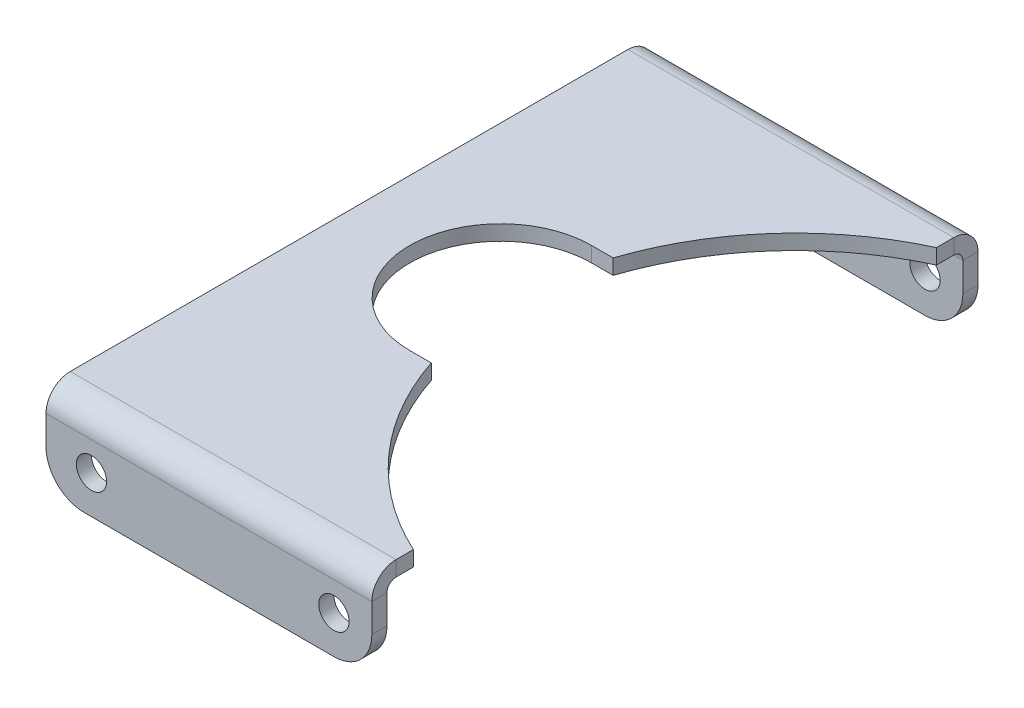
ISO-10303-21;
HEADER;
FILE_DESCRIPTION(('STEP AP214'),'2;1');
FILE_NAME('part.step','',(''),(''),'','','');
FILE_SCHEMA(('AUTOMOTIVE_DESIGN { 1 0 10303 214 1 1 1 1 }'));
ENDSEC;
DATA;
#1=APPLICATION_CONTEXT('core data for automotive mechanical design processes');
#2=APPLICATION_PROTOCOL_DEFINITION('international standard','automotive_design',2000,#1);
#3=PRODUCT_CONTEXT('',#1,'mechanical');
#4=PRODUCT('Part','Part','',(#3));
#5=PRODUCT_RELATED_PRODUCT_CATEGORY('part','',(#4));
#6=PRODUCT_DEFINITION_FORMATION('','',#4);
#7=PRODUCT_DEFINITION_CONTEXT('part definition',#1,'design');
#8=PRODUCT_DEFINITION('design','',#6,#7);
#9=PRODUCT_DEFINITION_SHAPE('','',#8);
#10=(LENGTH_UNIT() NAMED_UNIT(*) SI_UNIT(.MILLI.,.METRE.));
#11=(NAMED_UNIT(*) PLANE_ANGLE_UNIT() SI_UNIT($,.RADIAN.));
#12=(NAMED_UNIT(*) SI_UNIT($,.STERADIAN.) SOLID_ANGLE_UNIT());
#13=UNCERTAINTY_MEASURE_WITH_UNIT(LENGTH_MEASURE(1.E-05),#10,'distance_accuracy_value','');
#14=(GEOMETRIC_REPRESENTATION_CONTEXT(3) GLOBAL_UNCERTAINTY_ASSIGNED_CONTEXT((#13)) GLOBAL_UNIT_ASSIGNED_CONTEXT((#10,
#11,#12)) REPRESENTATION_CONTEXT('',''));
#15=CARTESIAN_POINT('',(0.,0.,0.));
#16=DIRECTION('',(0.,0.,1.));
#17=DIRECTION('',(1.,0.,0.));
#18=AXIS2_PLACEMENT_3D('',#15,#16,#17);
#19=CARTESIAN_POINT('',(-68.2625,0.,127.));
#20=DIRECTION('',(1.,0.,0.));
#21=DIRECTION('',(0.,0.,1.));
#22=AXIS2_PLACEMENT_3D('',#19,#20,#21);
#23=PLANE('',#22);
#24=DIRECTION('',(0.,1.,0.));
#25=VECTOR('',#24,1.);
#26=CARTESIAN_POINT('',(-68.2625,0.,-116.84));
#27=LINE('',#26,#25);
#28=CARTESIAN_POINT('',(-68.2625,-6.35,-116.84));
#29=VERTEX_POINT('',#28);
#30=CARTESIAN_POINT('',(-68.2625,0.,-116.84));
#31=VERTEX_POINT('',#30);
#32=EDGE_CURVE('E388',#29,#31,#27,.T.);
#33=ORIENTED_EDGE('',*,*,#32,.F.);
#34=DIRECTION('',(0.,0.,-1.));
#35=VECTOR('',#34,1.);
#36=CARTESIAN_POINT('',(-68.2625,-6.35000000000003,127.));
#37=LINE('',#36,#35);
#38=CARTESIAN_POINT('',(-68.2625,-6.35000000000003,116.84));
#39=VERTEX_POINT('',#38);
#40=EDGE_CURVE('E316',#29,#39,#37,.F.);
#41=ORIENTED_EDGE('',*,*,#40,.T.);
#42=DIRECTION('',(0.,1.,0.));
#43=VECTOR('',#42,1.);
#44=CARTESIAN_POINT('',(-68.2625,0.,116.84));
#45=LINE('',#44,#43);
#46=CARTESIAN_POINT('',(-68.2625,0.,116.84));
#47=VERTEX_POINT('',#46);
#48=EDGE_CURVE('E386',#39,#47,#45,.T.);
#49=ORIENTED_EDGE('',*,*,#48,.T.);
#50=DIRECTION('',(0.,0.,1.));
#51=VECTOR('',#50,1.);
#52=CARTESIAN_POINT('',(-68.2625,0.,127.));
#53=LINE('',#52,#51);
#54=EDGE_CURVE('E212',#31,#47,#53,.T.);
#55=ORIENTED_EDGE('',*,*,#54,.F.);
#56=EDGE_LOOP('',(#33,#41,#49,#55));
#57=FACE_BOUND('',#56,.T.);
#58=ADVANCED_FACE('F43',(#57),#23,.F.);
#59=CARTESIAN_POINT('',(-68.2625,-10.16,116.84));
#60=DIRECTION('',(1.,0.,0.));
#61=DIRECTION('',(0.,0.,-1.));
#62=AXIS2_PLACEMENT_3D('',#59,#60,#61);
#63=PLANE('',#62);
#64=ORIENTED_EDGE('',*,*,#48,.F.);
#65=CARTESIAN_POINT('',(-68.2625,-10.16,116.84));
#66=DIRECTION('',(-1.,0.,0.));
#67=DIRECTION('',(0.,0.,1.));
#68=AXIS2_PLACEMENT_3D('',#65,#66,#67);
#69=CIRCLE('',#68,3.81);
#70=CARTESIAN_POINT('',(-68.2625,-10.16,120.65));
#71=VERTEX_POINT('',#70);
#72=EDGE_CURVE('E330',#39,#71,#69,.F.);
#73=ORIENTED_EDGE('',*,*,#72,.T.);
#74=DIRECTION('',(0.,0.,1.));
#75=VECTOR('',#74,1.);
#76=CARTESIAN_POINT('',(-68.2625,-10.16,127.));
#77=LINE('',#76,#75);
#78=CARTESIAN_POINT('',(-68.2625,-10.16,127.));
#79=VERTEX_POINT('',#78);
#80=EDGE_CURVE('E384',#71,#79,#77,.T.);
#81=ORIENTED_EDGE('',*,*,#80,.T.);
#82=CARTESIAN_POINT('',(-68.2625,-10.16,116.84));
#83=DIRECTION('',(-1.,0.,0.));
#84=DIRECTION('',(0.,0.,1.));
#85=AXIS2_PLACEMENT_3D('',#82,#83,#84);
#86=CIRCLE('',#85,10.16);
#87=EDGE_CURVE('E270',#47,#79,#86,.F.);
#88=ORIENTED_EDGE('',*,*,#87,.F.);
#89=EDGE_LOOP('',(#64,#73,#81,#88));
#90=FACE_BOUND('',#89,.T.);
#91=ADVANCED_FACE('F437',(#90),#63,.F.);
#92=CARTESIAN_POINT('',(-68.2625,0.,127.));
#93=DIRECTION('',(1.,0.,0.));
#94=DIRECTION('',(0.,-1.,0.));
#95=AXIS2_PLACEMENT_3D('',#92,#93,#94);
#96=PLANE('',#95);
#97=ORIENTED_EDGE('',*,*,#80,.F.);
#98=DIRECTION('',(0.,1.,0.));
#99=VECTOR('',#98,1.);
#100=CARTESIAN_POINT('',(-68.2625,0.,120.65));
#101=LINE('',#100,#99);
#102=CARTESIAN_POINT('',(-68.2625,-22.225,120.65));
#103=VERTEX_POINT('',#102);
#104=EDGE_CURVE('E342',#71,#103,#101,.F.);
#105=ORIENTED_EDGE('',*,*,#104,.T.);
#106=DIRECTION('',(0.,0.,1.));
#107=VECTOR('',#106,1.);
#108=CARTESIAN_POINT('',(-68.2625,-22.225,127.));
#109=LINE('',#108,#107);
#110=CARTESIAN_POINT('',(-68.2625,-22.225,127.));
#111=VERTEX_POINT('',#110);
#112=EDGE_CURVE('E382',#103,#111,#109,.T.);
#113=ORIENTED_EDGE('',*,*,#112,.T.);
#114=DIRECTION('',(0.,-1.,0.));
#115=VECTOR('',#114,1.);
#116=CARTESIAN_POINT('',(-68.2625,0.,127.));
#117=LINE('',#116,#115);
#118=EDGE_CURVE('E459',#79,#111,#117,.T.);
#119=ORIENTED_EDGE('',*,*,#118,.F.);
#120=EDGE_LOOP('',(#97,#105,#113,#119));
#121=FACE_BOUND('',#120,.T.);
#122=ADVANCED_FACE('F457',(#121),#96,.F.);
#123=CARTESIAN_POINT('',(-52.3875,-22.225,127.));
#124=DIRECTION('',(0.,0.,-1.));
#125=DIRECTION('',(-1.,0.,0.));
#126=AXIS2_PLACEMENT_3D('',#123,#124,#125);
#127=CYLINDRICAL_SURFACE('',#126,15.875);
#128=ORIENTED_EDGE('',*,*,#112,.F.);
#129=CARTESIAN_POINT('',(-52.3875,-22.225,120.65));
#130=DIRECTION('',(0.,0.,-1.));
#131=DIRECTION('',(-1.,0.,0.));
#132=AXIS2_PLACEMENT_3D('',#129,#130,#131);
#133=CIRCLE('',#132,15.875);
#134=CARTESIAN_POINT('',(-52.3875,-38.1,120.65));
#135=VERTEX_POINT('',#134);
#136=EDGE_CURVE('E339',#103,#135,#133,.F.);
#137=ORIENTED_EDGE('',*,*,#136,.T.);
#138=DIRECTION('',(0.,0.,1.));
#139=VECTOR('',#138,1.);
#140=CARTESIAN_POINT('',(-52.3875,-38.1,127.));
#141=LINE('',#140,#139);
#142=CARTESIAN_POINT('',(-52.3875,-38.1,127.));
#143=VERTEX_POINT('',#142);
#144=EDGE_CURVE('E380',#135,#143,#141,.T.);
#145=ORIENTED_EDGE('',*,*,#144,.T.);
#146=CARTESIAN_POINT('',(-52.3875,-22.225,127.));
#147=DIRECTION('',(0.,0.,-1.));
#148=DIRECTION('',(-1.,0.,0.));
#149=AXIS2_PLACEMENT_3D('',#146,#147,#148);
#150=CIRCLE('',#149,15.875);
#151=EDGE_CURVE('E463',#111,#143,#150,.F.);
#152=ORIENTED_EDGE('',*,*,#151,.F.);
#153=EDGE_LOOP('',(#128,#137,#145,#152));
#154=FACE_BOUND('',#153,.T.);
#155=ADVANCED_FACE('F710',(#154),#127,.T.);
#156=CARTESIAN_POINT('',(68.2625,-38.1,127.));
#157=DIRECTION('',(0.,-1.,0.));
#158=DIRECTION('',(-1.,0.,0.));
#159=AXIS2_PLACEMENT_3D('',#156,#157,#158);
#160=PLANE('',#159);
#161=ORIENTED_EDGE('',*,*,#144,.F.);
#162=DIRECTION('',(-1.,0.,0.));
#163=VECTOR('',#162,1.);
#164=CARTESIAN_POINT('',(68.2625,-38.1,120.65));
#165=LINE('',#164,#163);
#166=CARTESIAN_POINT('',(52.3875,-38.1,120.65));
#167=VERTEX_POINT('',#166);
#168=EDGE_CURVE('E336',#167,#135,#165,.T.);
#169=ORIENTED_EDGE('',*,*,#168,.F.);
#170=DIRECTION('',(0.,0.,1.));
#171=VECTOR('',#170,1.);
#172=CARTESIAN_POINT('',(52.3875,-38.1,127.));
#173=LINE('',#172,#171);
#174=CARTESIAN_POINT('',(52.3875,-38.1,127.));
#175=VERTEX_POINT('',#174);
#176=EDGE_CURVE('E378',#167,#175,#173,.T.);
#177=ORIENTED_EDGE('',*,*,#176,.T.);
#178=DIRECTION('',(-1.,0.,0.));
#179=VECTOR('',#178,1.);
#180=CARTESIAN_POINT('',(68.2625,-38.1,127.));
#181=LINE('',#180,#179);
#182=EDGE_CURVE('E478',#175,#143,#181,.T.);
#183=ORIENTED_EDGE('',*,*,#182,.T.);
#184=EDGE_LOOP('',(#161,#169,#177,#183));
#185=FACE_BOUND('',#184,.T.);
#186=ADVANCED_FACE('F719',(#185),#160,.T.);
#187=CARTESIAN_POINT('',(52.3875,-22.225,127.));
#188=DIRECTION('',(0.,0.,-1.));
#189=DIRECTION('',(-1.,0.,0.));
#190=AXIS2_PLACEMENT_3D('',#187,#188,#189);
#191=CYLINDRICAL_SURFACE('',#190,15.875);
#192=ORIENTED_EDGE('',*,*,#176,.F.);
#193=CARTESIAN_POINT('',(52.3875,-22.225,120.65));
#194=DIRECTION('',(0.,0.,-1.));
#195=DIRECTION('',(-1.,0.,0.));
#196=AXIS2_PLACEMENT_3D('',#193,#194,#195);
#197=CIRCLE('',#196,15.875);
#198=CARTESIAN_POINT('',(68.2625,-22.225,120.65));
#199=VERTEX_POINT('',#198);
#200=EDGE_CURVE('E333',#167,#199,#197,.F.);
#201=ORIENTED_EDGE('',*,*,#200,.T.);
#202=DIRECTION('',(0.,0.,1.));
#203=VECTOR('',#202,1.);
#204=CARTESIAN_POINT('',(68.2625,-22.225,127.));
#205=LINE('',#204,#203);
#206=CARTESIAN_POINT('',(68.2625,-22.225,127.));
#207=VERTEX_POINT('',#206);
#208=EDGE_CURVE('E376',#199,#207,#205,.T.);
#209=ORIENTED_EDGE('',*,*,#208,.T.);
#210=CARTESIAN_POINT('',(52.3875,-22.225,127.));
#211=DIRECTION('',(0.,0.,-1.));
#212=DIRECTION('',(-1.,0.,0.));
#213=AXIS2_PLACEMENT_3D('',#210,#211,#212);
#214=CIRCLE('',#213,15.875);
#215=EDGE_CURVE('E473',#175,#207,#214,.F.);
#216=ORIENTED_EDGE('',*,*,#215,.F.);
#217=EDGE_LOOP('',(#192,#201,#209,#216));
#218=FACE_BOUND('',#217,.T.);
#219=ADVANCED_FACE('F731',(#218),#191,.T.);
#220=CARTESIAN_POINT('',(68.2625,0.,127.));
#221=DIRECTION('',(1.,0.,0.));
#222=DIRECTION('',(0.,-1.,0.));
#223=AXIS2_PLACEMENT_3D('',#220,#221,#222);
#224=PLANE('',#223);
#225=ORIENTED_EDGE('',*,*,#208,.F.);
#226=DIRECTION('',(0.,1.,0.));
#227=VECTOR('',#226,1.);
#228=CARTESIAN_POINT('',(68.2625,0.,120.65));
#229=LINE('',#228,#227);
#230=CARTESIAN_POINT('',(68.2625,-10.16,120.65));
#231=VERTEX_POINT('',#230);
#232=EDGE_CURVE('E322',#231,#199,#229,.F.);
#233=ORIENTED_EDGE('',*,*,#232,.F.);
#234=DIRECTION('',(0.,0.,1.));
#235=VECTOR('',#234,1.);
#236=CARTESIAN_POINT('',(68.2625,-10.16,127.));
#237=LINE('',#236,#235);
#238=CARTESIAN_POINT('',(68.2625,-10.16,127.));
#239=VERTEX_POINT('',#238);
#240=EDGE_CURVE('E374',#231,#239,#237,.T.);
#241=ORIENTED_EDGE('',*,*,#240,.T.);
#242=DIRECTION('',(0.,-1.,0.));
#243=VECTOR('',#242,1.);
#244=CARTESIAN_POINT('',(68.2625,0.,127.));
#245=LINE('',#244,#243);
#246=EDGE_CURVE('E470',#239,#207,#245,.T.);
#247=ORIENTED_EDGE('',*,*,#246,.T.);
#248=EDGE_LOOP('',(#225,#233,#241,#247));
#249=FACE_BOUND('',#248,.T.);
#250=ADVANCED_FACE('F670',(#249),#224,.T.);
#251=CARTESIAN_POINT('',(68.2625,-10.16,116.84));
#252=DIRECTION('',(-1.,0.,0.));
#253=DIRECTION('',(0.,0.,1.));
#254=AXIS2_PLACEMENT_3D('',#251,#252,#253);
#255=PLANE('',#254);
#256=ORIENTED_EDGE('',*,*,#240,.F.);
#257=CARTESIAN_POINT('',(68.2625,-10.16,116.84));
#258=DIRECTION('',(-1.,0.,0.));
#259=DIRECTION('',(0.,0.,1.));
#260=AXIS2_PLACEMENT_3D('',#257,#258,#259);
#261=CIRCLE('',#260,3.81);
#262=CARTESIAN_POINT('',(68.2625,-6.35000000000003,116.84));
#263=VERTEX_POINT('',#262);
#264=EDGE_CURVE('E327',#231,#263,#261,.T.);
#265=ORIENTED_EDGE('',*,*,#264,.T.);
#266=DIRECTION('',(0.,1.,0.));
#267=VECTOR('',#266,1.);
#268=CARTESIAN_POINT('',(68.2625,0.,116.84));
#269=LINE('',#268,#267);
#270=CARTESIAN_POINT('',(68.2625,0.,116.84));
#271=VERTEX_POINT('',#270);
#272=EDGE_CURVE('E372',#263,#271,#269,.T.);
#273=ORIENTED_EDGE('',*,*,#272,.T.);
#274=CARTESIAN_POINT('',(68.2625,-10.16,116.84));
#275=DIRECTION('',(1.,0.,0.));
#276=DIRECTION('',(0.,0.,-1.));
#277=AXIS2_PLACEMENT_3D('',#274,#275,#276);
#278=CIRCLE('',#277,10.16);
#279=EDGE_CURVE('E260',#239,#271,#278,.F.);
#280=ORIENTED_EDGE('',*,*,#279,.F.);
#281=EDGE_LOOP('',(#256,#265,#273,#280));
#282=FACE_BOUND('',#281,.T.);
#283=ADVANCED_FACE('F444',(#282),#255,.F.);
#284=CARTESIAN_POINT('',(68.2625,0.,127.));
#285=DIRECTION('',(1.,0.,0.));
#286=DIRECTION('',(0.,0.,1.));
#287=AXIS2_PLACEMENT_3D('',#284,#285,#286);
#288=PLANE('',#287);
#289=DIRECTION('',(0.,1.,0.));
#290=VECTOR('',#289,1.);
#291=CARTESIAN_POINT('',(68.2625,-38.1,109.580745086671));
#292=LINE('',#291,#290);
#293=CARTESIAN_POINT('',(68.2625,0.,109.580745086671));
#294=VERTEX_POINT('',#293);
#295=CARTESIAN_POINT('',(68.2625,-6.35000000000003,109.580745086671));
#296=VERTEX_POINT('',#295);
#297=EDGE_CURVE('E57',#294,#296,#292,.F.);
#298=ORIENTED_EDGE('',*,*,#297,.F.);
#299=DIRECTION('',(0.,0.,1.));
#300=VECTOR('',#299,1.);
#301=CARTESIAN_POINT('',(68.2625,0.,127.));
#302=LINE('',#301,#300);
#303=EDGE_CURVE('E214',#294,#271,#302,.T.);
#304=ORIENTED_EDGE('',*,*,#303,.T.);
#305=ORIENTED_EDGE('',*,*,#272,.F.);
#306=DIRECTION('',(0.,0.,-1.));
#307=VECTOR('',#306,1.);
#308=CARTESIAN_POINT('',(68.2625,-6.35000000000003,127.));
#309=LINE('',#308,#307);
#310=EDGE_CURVE('E325',#296,#263,#309,.F.);
#311=ORIENTED_EDGE('',*,*,#310,.F.);
#312=EDGE_LOOP('',(#298,#304,#305,#311));
#313=FACE_BOUND('',#312,.T.);
#314=ADVANCED_FACE('F448',(#313),#288,.T.);
#315=CARTESIAN_POINT('',(68.2625,0.,38.1));
#316=DIRECTION('',(0.,0.,-1.));
#317=DIRECTION('',(1.,0.,0.));
#318=AXIS2_PLACEMENT_3D('',#315,#316,#317);
#319=PLANE('',#318);
#320=DIRECTION('',(0.,1.,0.));
#321=VECTOR('',#320,1.);
#322=CARTESIAN_POINT('',(4.26874700401834,-38.1,38.1));
#323=LINE('',#322,#321);
#324=CARTESIAN_POINT('',(4.26874700401834,-6.35000000000002,38.1));
#325=VERTEX_POINT('',#324);
#326=CARTESIAN_POINT('',(4.26874700401834,0.,38.1));
#327=VERTEX_POINT('',#326);
#328=EDGE_CURVE('E489',#325,#327,#323,.T.);
#329=ORIENTED_EDGE('',*,*,#328,.F.);
#330=DIRECTION('',(1.,0.,0.));
#331=VECTOR('',#330,1.);
#332=CARTESIAN_POINT('',(68.2625,-6.35000000000002,38.1));
#333=LINE('',#332,#331);
#334=CARTESIAN_POINT('',(-4.7625,-6.35000000000002,38.1));
#335=VERTEX_POINT('',#334);
#336=EDGE_CURVE('E292',#335,#325,#333,.T.);
#337=ORIENTED_EDGE('',*,*,#336,.F.);
#338=DIRECTION('',(0.,1.,0.));
#339=VECTOR('',#338,1.);
#340=CARTESIAN_POINT('',(-4.7625,0.,38.1));
#341=LINE('',#340,#339);
#342=CARTESIAN_POINT('',(-4.7625,0.,38.1));
#343=VERTEX_POINT('',#342);
#344=EDGE_CURVE('E370',#335,#343,#341,.T.);
#345=ORIENTED_EDGE('',*,*,#344,.T.);
#346=DIRECTION('',(1.,0.,0.));
#347=VECTOR('',#346,1.);
#348=CARTESIAN_POINT('',(68.2625,0.,38.1));
#349=LINE('',#348,#347);
#350=EDGE_CURVE('E219',#343,#327,#349,.T.);
#351=ORIENTED_EDGE('',*,*,#350,.T.);
#352=EDGE_LOOP('',(#329,#337,#345,#351));
#353=FACE_BOUND('',#352,.T.);
#354=ADVANCED_FACE('F501',(#353),#319,.T.);
#355=CARTESIAN_POINT('',(-4.7625,0.,0.));
#356=DIRECTION('',(0.,-1.,0.));
#357=DIRECTION('',(0.,0.,-1.));
#358=AXIS2_PLACEMENT_3D('',#355,#356,#357);
#359=CYLINDRICAL_SURFACE('',#358,38.1);
#360=ORIENTED_EDGE('',*,*,#344,.F.);
#361=CARTESIAN_POINT('',(-4.7625,-6.35,0.));
#362=DIRECTION('',(0.,1.,0.));
#363=DIRECTION('',(0.,0.,1.));
#364=AXIS2_PLACEMENT_3D('',#361,#362,#363);
#365=CIRCLE('',#364,38.1);
#366=CARTESIAN_POINT('',(-4.7625,-6.35000000000001,-38.1));
#367=VERTEX_POINT('',#366);
#368=EDGE_CURVE('E319',#367,#335,#365,.T.);
#369=ORIENTED_EDGE('',*,*,#368,.F.);
#370=DIRECTION('',(0.,1.,0.));
#371=VECTOR('',#370,1.);
#372=CARTESIAN_POINT('',(-4.7625,0.,-38.1));
#373=LINE('',#372,#371);
#374=CARTESIAN_POINT('',(-4.7625,0.,-38.1));
#375=VERTEX_POINT('',#374);
#376=EDGE_CURVE('E367',#367,#375,#373,.T.);
#377=ORIENTED_EDGE('',*,*,#376,.T.);
#378=CARTESIAN_POINT('',(-4.7625,0.,0.));
#379=DIRECTION('',(0.,1.,0.));
#380=DIRECTION('',(0.,0.,1.));
#381=AXIS2_PLACEMENT_3D('',#378,#379,#380);
#382=CIRCLE('',#381,38.1);
#383=EDGE_CURVE('E217',#375,#343,#382,.T.);
#384=ORIENTED_EDGE('',*,*,#383,.T.);
#385=EDGE_LOOP('',(#360,#369,#377,#384));
#386=FACE_BOUND('',#385,.T.);
#387=ADVANCED_FACE('F495',(#386),#359,.F.);
#388=CARTESIAN_POINT('',(-4.7625,0.,-38.1));
#389=DIRECTION('',(0.,0.,1.));
#390=DIRECTION('',(-1.,0.,0.));
#391=AXIS2_PLACEMENT_3D('',#388,#389,#390);
#392=PLANE('',#391);
#393=DIRECTION('',(0.,1.,0.));
#394=VECTOR('',#393,1.);
#395=CARTESIAN_POINT('',(4.26874700401834,-38.1,-38.1));
#396=LINE('',#395,#394);
#397=CARTESIAN_POINT('',(4.26874700401834,0.,-38.1));
#398=VERTEX_POINT('',#397);
#399=CARTESIAN_POINT('',(4.26874700401834,-6.35000000000001,-38.1));
#400=VERTEX_POINT('',#399);
#401=EDGE_CURVE('E65',#398,#400,#396,.F.);
#402=ORIENTED_EDGE('',*,*,#401,.F.);
#403=DIRECTION('',(-1.,0.,0.));
#404=VECTOR('',#403,1.);
#405=CARTESIAN_POINT('',(-4.7625,0.,-38.1));
#406=LINE('',#405,#404);
#407=EDGE_CURVE('E207',#398,#375,#406,.T.);
#408=ORIENTED_EDGE('',*,*,#407,.T.);
#409=ORIENTED_EDGE('',*,*,#376,.F.);
#410=DIRECTION('',(1.,0.,0.));
#411=VECTOR('',#410,1.);
#412=CARTESIAN_POINT('',(68.2625,-6.35000000000001,-38.1));
#413=LINE('',#412,#411);
#414=EDGE_CURVE('E317',#400,#367,#413,.F.);
#415=ORIENTED_EDGE('',*,*,#414,.F.);
#416=EDGE_LOOP('',(#402,#408,#409,#415));
#417=FACE_BOUND('',#416,.T.);
#418=ADVANCED_FACE('F500',(#417),#392,.T.);
#419=DIRECTION('',(0.,1.,0.));
#420=VECTOR('',#419,1.);
#421=CARTESIAN_POINT('',(68.2625,-38.1,-109.580745086671));
#422=LINE('',#421,#420);
#423=CARTESIAN_POINT('',(68.2625,-6.35,-109.580745086671));
#424=VERTEX_POINT('',#423);
#425=CARTESIAN_POINT('',(68.2625,0.,-109.580745086671));
#426=VERTEX_POINT('',#425);
#427=EDGE_CURVE('E189',#424,#426,#422,.T.);
#428=ORIENTED_EDGE('',*,*,#427,.F.);
#429=DIRECTION('',(0.,0.,-1.));
#430=VECTOR('',#429,1.);
#431=CARTESIAN_POINT('',(68.2625,-6.35000000000003,127.));
#432=LINE('',#431,#430);
#433=CARTESIAN_POINT('',(68.2625,-6.35,-116.84));
#434=VERTEX_POINT('',#433);
#435=EDGE_CURVE('E314',#434,#424,#432,.F.);
#436=ORIENTED_EDGE('',*,*,#435,.F.);
#437=DIRECTION('',(0.,1.,0.));
#438=VECTOR('',#437,1.);
#439=CARTESIAN_POINT('',(68.2625,0.,-116.84));
#440=LINE('',#439,#438);
#441=CARTESIAN_POINT('',(68.2625,0.,-116.84));
#442=VERTEX_POINT('',#441);
#443=EDGE_CURVE('E211',#434,#442,#440,.T.);
#444=ORIENTED_EDGE('',*,*,#443,.T.);
#445=EDGE_CURVE('E204',#442,#426,#302,.T.);
#446=ORIENTED_EDGE('',*,*,#445,.T.);
#447=EDGE_LOOP('',(#428,#436,#444,#446));
#448=FACE_BOUND('',#447,.T.);
#449=ADVANCED_FACE('F210',(#448),#288,.T.);
#450=CARTESIAN_POINT('',(68.2625,-10.16,-116.84));
#451=DIRECTION('',(-1.,0.,0.));
#452=DIRECTION('',(0.,0.,1.));
#453=AXIS2_PLACEMENT_3D('',#450,#451,#452);
#454=PLANE('',#453);
#455=ORIENTED_EDGE('',*,*,#443,.F.);
#456=CARTESIAN_POINT('',(68.2625,-10.16,-116.84));
#457=DIRECTION('',(-1.,0.,0.));
#458=DIRECTION('',(0.,0.,1.));
#459=AXIS2_PLACEMENT_3D('',#456,#457,#458);
#460=CIRCLE('',#459,3.81);
#461=CARTESIAN_POINT('',(68.2625,-10.16,-120.65));
#462=VERTEX_POINT('',#461);
#463=EDGE_CURVE('E309',#434,#462,#460,.T.);
#464=ORIENTED_EDGE('',*,*,#463,.T.);
#465=DIRECTION('',(0.,0.,-1.));
#466=VECTOR('',#465,1.);
#467=CARTESIAN_POINT('',(68.2625,-10.16,-127.));
#468=LINE('',#467,#466);
#469=CARTESIAN_POINT('',(68.2625,-10.16,-127.));
#470=VERTEX_POINT('',#469);
#471=EDGE_CURVE('E364',#462,#470,#468,.T.);
#472=ORIENTED_EDGE('',*,*,#471,.T.);
#473=CARTESIAN_POINT('',(68.2625,-10.16,-116.84));
#474=DIRECTION('',(1.,0.,0.));
#475=DIRECTION('',(0.,0.,-1.));
#476=AXIS2_PLACEMENT_3D('',#473,#474,#475);
#477=CIRCLE('',#476,10.16);
#478=EDGE_CURVE('E259',#442,#470,#477,.F.);
#479=ORIENTED_EDGE('',*,*,#478,.F.);
#480=EDGE_LOOP('',(#455,#464,#472,#479));
#481=FACE_BOUND('',#480,.T.);
#482=ADVANCED_FACE('F566',(#481),#454,.F.);
#483=CARTESIAN_POINT('',(68.2625,0.,-127.));
#484=DIRECTION('',(1.,0.,0.));
#485=DIRECTION('',(0.,1.,0.));
#486=AXIS2_PLACEMENT_3D('',#483,#484,#485);
#487=PLANE('',#486);
#488=ORIENTED_EDGE('',*,*,#471,.F.);
#489=DIRECTION('',(0.,1.,0.));
#490=VECTOR('',#489,1.);
#491=CARTESIAN_POINT('',(68.2625,0.,-120.65));
#492=LINE('',#491,#490);
#493=CARTESIAN_POINT('',(68.2625,-22.225,-120.65));
#494=VERTEX_POINT('',#493);
#495=EDGE_CURVE('E299',#494,#462,#492,.T.);
#496=ORIENTED_EDGE('',*,*,#495,.F.);
#497=DIRECTION('',(0.,0.,-1.));
#498=VECTOR('',#497,1.);
#499=CARTESIAN_POINT('',(68.2625,-22.225,-127.));
#500=LINE('',#499,#498);
#501=CARTESIAN_POINT('',(68.2625,-22.225,-127.));
#502=VERTEX_POINT('',#501);
#503=EDGE_CURVE('E362',#494,#502,#500,.T.);
#504=ORIENTED_EDGE('',*,*,#503,.T.);
#505=DIRECTION('',(0.,1.,0.));
#506=VECTOR('',#505,1.);
#507=CARTESIAN_POINT('',(68.2625,0.,-127.));
#508=LINE('',#507,#506);
#509=EDGE_CURVE('E244',#502,#470,#508,.T.);
#510=ORIENTED_EDGE('',*,*,#509,.T.);
#511=EDGE_LOOP('',(#488,#496,#504,#510));
#512=FACE_BOUND('',#511,.T.);
#513=ADVANCED_FACE('F408',(#512),#487,.T.);
#514=CARTESIAN_POINT('',(52.3875,-22.225,-127.));
#515=DIRECTION('',(0.,0.,1.));
#516=DIRECTION('',(1.,0.,0.));
#517=AXIS2_PLACEMENT_3D('',#514,#515,#516);
#518=CYLINDRICAL_SURFACE('',#517,15.875);
#519=ORIENTED_EDGE('',*,*,#503,.F.);
#520=CARTESIAN_POINT('',(52.3875,-22.225,-120.65));
#521=DIRECTION('',(0.,0.,1.));
#522=DIRECTION('',(1.,0.,0.));
#523=AXIS2_PLACEMENT_3D('',#520,#521,#522);
#524=CIRCLE('',#523,15.875);
#525=CARTESIAN_POINT('',(52.3875,-38.1,-120.65));
#526=VERTEX_POINT('',#525);
#527=EDGE_CURVE('E283',#494,#526,#524,.F.);
#528=ORIENTED_EDGE('',*,*,#527,.T.);
#529=DIRECTION('',(0.,0.,-1.));
#530=VECTOR('',#529,1.);
#531=CARTESIAN_POINT('',(52.3875,-38.1,-127.));
#532=LINE('',#531,#530);
#533=CARTESIAN_POINT('',(52.3875,-38.1,-127.));
#534=VERTEX_POINT('',#533);
#535=EDGE_CURVE('E360',#526,#534,#532,.T.);
#536=ORIENTED_EDGE('',*,*,#535,.T.);
#537=CARTESIAN_POINT('',(52.3875,-22.225,-127.));
#538=DIRECTION('',(0.,0.,1.));
#539=DIRECTION('',(1.,0.,0.));
#540=AXIS2_PLACEMENT_3D('',#537,#538,#539);
#541=CIRCLE('',#540,15.875);
#542=EDGE_CURVE('E247',#502,#534,#541,.F.);
#543=ORIENTED_EDGE('',*,*,#542,.F.);
#544=EDGE_LOOP('',(#519,#528,#536,#543));
#545=FACE_BOUND('',#544,.T.);
#546=ADVANCED_FACE('F412',(#545),#518,.T.);
#547=CARTESIAN_POINT('',(68.2625,-38.1,-127.));
#548=DIRECTION('',(0.,1.,0.));
#549=DIRECTION('',(-1.,0.,0.));
#550=AXIS2_PLACEMENT_3D('',#547,#548,#549);
#551=PLANE('',#550);
#552=ORIENTED_EDGE('',*,*,#535,.F.);
#553=DIRECTION('',(1.,0.,0.));
#554=VECTOR('',#553,1.);
#555=CARTESIAN_POINT('',(68.2625,-38.1,-120.65));
#556=LINE('',#555,#554);
#557=CARTESIAN_POINT('',(-52.3875,-38.1,-120.65));
#558=VERTEX_POINT('',#557);
#559=EDGE_CURVE('E295',#526,#558,#556,.F.);
#560=ORIENTED_EDGE('',*,*,#559,.T.);
#561=DIRECTION('',(0.,0.,-1.));
#562=VECTOR('',#561,1.);
#563=CARTESIAN_POINT('',(-52.3875,-38.1,-127.));
#564=LINE('',#563,#562);
#565=CARTESIAN_POINT('',(-52.3875,-38.1,-127.));
#566=VERTEX_POINT('',#565);
#567=EDGE_CURVE('E358',#558,#566,#564,.T.);
#568=ORIENTED_EDGE('',*,*,#567,.T.);
#569=DIRECTION('',(-1.,0.,0.));
#570=VECTOR('',#569,1.);
#571=CARTESIAN_POINT('',(68.2625,-38.1,-127.));
#572=LINE('',#571,#570);
#573=EDGE_CURVE('E235',#534,#566,#572,.T.);
#574=ORIENTED_EDGE('',*,*,#573,.F.);
#575=EDGE_LOOP('',(#552,#560,#568,#574));
#576=FACE_BOUND('',#575,.T.);
#577=ADVANCED_FACE('F417',(#576),#551,.F.);
#578=CARTESIAN_POINT('',(-52.3875,-22.225,-127.));
#579=DIRECTION('',(0.,0.,1.));
#580=DIRECTION('',(1.,0.,0.));
#581=AXIS2_PLACEMENT_3D('',#578,#579,#580);
#582=CYLINDRICAL_SURFACE('',#581,15.875);
#583=ORIENTED_EDGE('',*,*,#567,.F.);
#584=CARTESIAN_POINT('',(-52.3875,-22.225,-120.65));
#585=DIRECTION('',(0.,0.,1.));
#586=DIRECTION('',(1.,0.,0.));
#587=AXIS2_PLACEMENT_3D('',#584,#585,#586);
#588=CIRCLE('',#587,15.875);
#589=CARTESIAN_POINT('',(-68.2625,-22.225,-120.65));
#590=VERTEX_POINT('',#589);
#591=EDGE_CURVE('E300',#558,#590,#588,.F.);
#592=ORIENTED_EDGE('',*,*,#591,.T.);
#593=DIRECTION('',(0.,0.,-1.));
#594=VECTOR('',#593,1.);
#595=CARTESIAN_POINT('',(-68.2625,-22.225,-127.));
#596=LINE('',#595,#594);
#597=CARTESIAN_POINT('',(-68.2625,-22.225,-127.));
#598=VERTEX_POINT('',#597);
#599=EDGE_CURVE('E356',#590,#598,#596,.T.);
#600=ORIENTED_EDGE('',*,*,#599,.T.);
#601=CARTESIAN_POINT('',(-52.3875,-22.225,-127.));
#602=DIRECTION('',(0.,0.,1.));
#603=DIRECTION('',(1.,0.,0.));
#604=AXIS2_PLACEMENT_3D('',#601,#602,#603);
#605=CIRCLE('',#604,15.875);
#606=EDGE_CURVE('E238',#566,#598,#605,.F.);
#607=ORIENTED_EDGE('',*,*,#606,.F.);
#608=EDGE_LOOP('',(#583,#592,#600,#607));
#609=FACE_BOUND('',#608,.T.);
#610=ADVANCED_FACE('F419',(#609),#582,.T.);
#611=CARTESIAN_POINT('',(-68.2625,0.,-127.));
#612=DIRECTION('',(1.,0.,0.));
#613=DIRECTION('',(0.,1.,0.));
#614=AXIS2_PLACEMENT_3D('',#611,#612,#613);
#615=PLANE('',#614);
#616=ORIENTED_EDGE('',*,*,#599,.F.);
#617=DIRECTION('',(0.,1.,0.));
#618=VECTOR('',#617,1.);
#619=CARTESIAN_POINT('',(-68.2625,0.,-120.65));
#620=LINE('',#619,#618);
#621=CARTESIAN_POINT('',(-68.2625,-10.16,-120.65));
#622=VERTEX_POINT('',#621);
#623=EDGE_CURVE('E296',#590,#622,#620,.T.);
#624=ORIENTED_EDGE('',*,*,#623,.T.);
#625=DIRECTION('',(0.,0.,-1.));
#626=VECTOR('',#625,1.);
#627=CARTESIAN_POINT('',(-68.2625,-10.16,-127.));
#628=LINE('',#627,#626);
#629=CARTESIAN_POINT('',(-68.2625,-10.16,-127.));
#630=VERTEX_POINT('',#629);
#631=EDGE_CURVE('E269',#622,#630,#628,.T.);
#632=ORIENTED_EDGE('',*,*,#631,.T.);
#633=DIRECTION('',(0.,1.,0.));
#634=VECTOR('',#633,1.);
#635=CARTESIAN_POINT('',(-68.2625,0.,-127.));
#636=LINE('',#635,#634);
#637=EDGE_CURVE('E241',#598,#630,#636,.T.);
#638=ORIENTED_EDGE('',*,*,#637,.F.);
#639=EDGE_LOOP('',(#616,#624,#632,#638));
#640=FACE_BOUND('',#639,.T.);
#641=ADVANCED_FACE('F391',(#640),#615,.F.);
#642=CARTESIAN_POINT('',(-49.2125,-22.225,127.));
#643=DIRECTION('',(0.,0.,-1.));
#644=DIRECTION('',(-1.,0.,0.));
#645=AXIS2_PLACEMENT_3D('',#642,#643,#644);
#646=CYLINDRICAL_SURFACE('',#645,6.35);
#647=CARTESIAN_POINT('',(-49.2125,-22.225,127.));
#648=DIRECTION('',(0.,0.,1.));
#649=DIRECTION('',(1.,0.,0.));
#650=AXIS2_PLACEMENT_3D('',#647,#648,#649);
#651=CIRCLE('',#650,6.35);
#652=CARTESIAN_POINT('',(-42.8625,-22.225,127.));
#653=VERTEX_POINT('',#652);
#654=EDGE_CURVE('E263',#653,#653,#651,.T.);
#655=ORIENTED_EDGE('',*,*,#654,.T.);
#656=EDGE_LOOP('',(#655));
#657=FACE_BOUND('',#656,.T.);
#658=CARTESIAN_POINT('',(-49.2125,-22.225,120.65));
#659=DIRECTION('',(0.,0.,1.));
#660=DIRECTION('',(1.,0.,0.));
#661=AXIS2_PLACEMENT_3D('',#658,#659,#660);
#662=CIRCLE('',#661,6.35);
#663=CARTESIAN_POINT('',(-42.8625,-22.225,120.65));
#664=VERTEX_POINT('',#663);
#665=EDGE_CURVE('E312',#664,#664,#662,.T.);
#666=ORIENTED_EDGE('',*,*,#665,.F.);
#667=EDGE_LOOP('',(#666));
#668=FACE_BOUND('',#667,.T.);
#669=ADVANCED_FACE('F522',(#657,#668),#646,.F.);
#670=CARTESIAN_POINT('',(52.3875,-22.225,127.));
#671=DIRECTION('',(0.,0.,-1.));
#672=DIRECTION('',(-1.,0.,0.));
#673=AXIS2_PLACEMENT_3D('',#670,#671,#672);
#674=CYLINDRICAL_SURFACE('',#673,6.35);
#675=CARTESIAN_POINT('',(52.3875,-22.225,127.));
#676=DIRECTION('',(0.,0.,1.));
#677=DIRECTION('',(-1.,0.,0.));
#678=AXIS2_PLACEMENT_3D('',#675,#676,#677);
#679=CIRCLE('',#678,6.35);
#680=CARTESIAN_POINT('',(46.0375,-22.225,127.));
#681=VERTEX_POINT('',#680);
#682=EDGE_CURVE('E464',#681,#681,#679,.T.);
#683=ORIENTED_EDGE('',*,*,#682,.T.);
#684=EDGE_LOOP('',(#683));
#685=FACE_BOUND('',#684,.T.);
#686=CARTESIAN_POINT('',(52.3875,-22.225,120.65));
#687=DIRECTION('',(0.,0.,1.));
#688=DIRECTION('',(1.,0.,0.));
#689=AXIS2_PLACEMENT_3D('',#686,#687,#688);
#690=CIRCLE('',#689,6.35);
#691=CARTESIAN_POINT('',(58.7375,-22.225,120.65));
#692=VERTEX_POINT('',#691);
#693=EDGE_CURVE('E345',#692,#692,#690,.T.);
#694=ORIENTED_EDGE('',*,*,#693,.F.);
#695=EDGE_LOOP('',(#694));
#696=FACE_BOUND('',#695,.T.);
#697=ADVANCED_FACE('F45',(#685,#696),#674,.F.);
#698=CARTESIAN_POINT('',(-49.2125,-22.225,-127.));
#699=DIRECTION('',(0.,0.,1.));
#700=DIRECTION('',(1.,0.,0.));
#701=AXIS2_PLACEMENT_3D('',#698,#699,#700);
#702=CYLINDRICAL_SURFACE('',#701,6.35);
#703=CARTESIAN_POINT('',(-49.2125,-22.225,-127.));
#704=DIRECTION('',(0.,0.,1.));
#705=DIRECTION('',(1.,0.,0.));
#706=AXIS2_PLACEMENT_3D('',#703,#704,#705);
#707=CIRCLE('',#706,6.35);
#708=CARTESIAN_POINT('',(-42.8625,-22.225,-127.));
#709=VERTEX_POINT('',#708);
#710=EDGE_CURVE('E224',#709,#709,#707,.T.);
#711=ORIENTED_EDGE('',*,*,#710,.F.);
#712=EDGE_LOOP('',(#711));
#713=FACE_BOUND('',#712,.T.);
#714=CARTESIAN_POINT('',(-49.2125,-22.225,-120.65));
#715=DIRECTION('',(0.,0.,1.));
#716=DIRECTION('',(1.,0.,0.));
#717=AXIS2_PLACEMENT_3D('',#714,#715,#716);
#718=CIRCLE('',#717,6.35);
#719=CARTESIAN_POINT('',(-42.8625,-22.225,-120.65));
#720=VERTEX_POINT('',#719);
#721=EDGE_CURVE('E288',#720,#720,#718,.T.);
#722=ORIENTED_EDGE('',*,*,#721,.T.);
#723=EDGE_LOOP('',(#722));
#724=FACE_BOUND('',#723,.T.);
#725=ADVANCED_FACE('F529',(#713,#724),#702,.F.);
#726=CARTESIAN_POINT('',(52.3875,-22.225,-127.));
#727=DIRECTION('',(0.,0.,1.));
#728=DIRECTION('',(1.,0.,0.));
#729=AXIS2_PLACEMENT_3D('',#726,#727,#728);
#730=CYLINDRICAL_SURFACE('',#729,6.35);
#731=CARTESIAN_POINT('',(52.3875,-22.225,-127.));
#732=DIRECTION('',(0.,0.,1.));
#733=DIRECTION('',(-1.,0.,0.));
#734=AXIS2_PLACEMENT_3D('',#731,#732,#733);
#735=CIRCLE('',#734,6.35);
#736=CARTESIAN_POINT('',(46.0375,-22.225,-127.));
#737=VERTEX_POINT('',#736);
#738=EDGE_CURVE('E230',#737,#737,#735,.T.);
#739=ORIENTED_EDGE('',*,*,#738,.F.);
#740=EDGE_LOOP('',(#739));
#741=FACE_BOUND('',#740,.T.);
#742=CARTESIAN_POINT('',(52.3875,-22.225,-120.65));
#743=DIRECTION('',(0.,0.,1.));
#744=DIRECTION('',(1.,0.,0.));
#745=AXIS2_PLACEMENT_3D('',#742,#743,#744);
#746=CIRCLE('',#745,6.35);
#747=CARTESIAN_POINT('',(58.7375,-22.225,-120.65));
#748=VERTEX_POINT('',#747);
#749=EDGE_CURVE('E291',#748,#748,#746,.T.);
#750=ORIENTED_EDGE('',*,*,#749,.T.);
#751=EDGE_LOOP('',(#750));
#752=FACE_BOUND('',#751,.T.);
#753=ADVANCED_FACE('F521',(#741,#752),#730,.F.);
#754=CARTESIAN_POINT('',(-68.2625,-10.16,-116.84));
#755=DIRECTION('',(1.,0.,0.));
#756=DIRECTION('',(0.,0.,-1.));
#757=AXIS2_PLACEMENT_3D('',#754,#755,#756);
#758=PLANE('',#757);
#759=CARTESIAN_POINT('',(-68.2625,-10.16,-116.84));
#760=DIRECTION('',(-1.,0.,0.));
#761=DIRECTION('',(0.,0.,1.));
#762=AXIS2_PLACEMENT_3D('',#759,#760,#761);
#763=CIRCLE('',#762,3.81);
#764=EDGE_CURVE('E313',#622,#29,#763,.F.);
#765=ORIENTED_EDGE('',*,*,#764,.T.);
#766=ORIENTED_EDGE('',*,*,#32,.T.);
#767=CARTESIAN_POINT('',(-68.2625,-10.16,-116.84));
#768=DIRECTION('',(-1.,0.,0.));
#769=DIRECTION('',(0.,0.,1.));
#770=AXIS2_PLACEMENT_3D('',#767,#768,#769);
#771=CIRCLE('',#770,10.16);
#772=EDGE_CURVE('E256',#630,#31,#771,.F.);
#773=ORIENTED_EDGE('',*,*,#772,.F.);
#774=ORIENTED_EDGE('',*,*,#631,.F.);
#775=EDGE_LOOP('',(#765,#766,#773,#774));
#776=FACE_BOUND('',#775,.T.);
#777=ADVANCED_FACE('F401',(#776),#758,.F.);
#778=CARTESIAN_POINT('',(68.2625,0.,-127.));
#779=DIRECTION('',(0.,0.,1.));
#780=DIRECTION('',(1.,0.,0.));
#781=AXIS2_PLACEMENT_3D('',#778,#779,#780);
#782=PLANE('',#781);
#783=ORIENTED_EDGE('',*,*,#710,.T.);
#784=EDGE_LOOP('',(#783));
#785=FACE_BOUND('',#784,.T.);
#786=ORIENTED_EDGE('',*,*,#738,.T.);
#787=EDGE_LOOP('',(#786));
#788=FACE_BOUND('',#787,.T.);
#789=ORIENTED_EDGE('',*,*,#637,.T.);
#790=DIRECTION('',(-1.,0.,0.));
#791=VECTOR('',#790,1.);
#792=CARTESIAN_POINT('',(68.2625,-10.16,-127.));
#793=LINE('',#792,#791);
#794=EDGE_CURVE('E252',#630,#470,#793,.F.);
#795=ORIENTED_EDGE('',*,*,#794,.T.);
#796=ORIENTED_EDGE('',*,*,#509,.F.);
#797=ORIENTED_EDGE('',*,*,#542,.T.);
#798=ORIENTED_EDGE('',*,*,#573,.T.);
#799=ORIENTED_EDGE('',*,*,#606,.T.);
#800=EDGE_LOOP('',(#789,#795,#796,#797,#798,#799));
#801=FACE_BOUND('',#800,.T.);
#802=ADVANCED_FACE('F397',(#785,#788,#801),#782,.F.);
#803=CARTESIAN_POINT('',(68.2625,0.,127.));
#804=DIRECTION('',(0.,-1.,0.));
#805=DIRECTION('',(0.,0.,-1.));
#806=AXIS2_PLACEMENT_3D('',#803,#804,#805);
#807=PLANE('',#806);
#808=ORIENTED_EDGE('',*,*,#303,.F.);
#809=CARTESIAN_POINT('',(118.745,0.,0.));
#810=DIRECTION('',(0.,1.,0.));
#811=DIRECTION('',(0.,0.,1.));
#812=AXIS2_PLACEMENT_3D('',#809,#810,#811);
#813=CIRCLE('',#812,120.65);
#814=EDGE_CURVE('E208',#327,#294,#813,.T.);
#815=ORIENTED_EDGE('',*,*,#814,.F.);
#816=ORIENTED_EDGE('',*,*,#350,.F.);
#817=ORIENTED_EDGE('',*,*,#383,.F.);
#818=ORIENTED_EDGE('',*,*,#407,.F.);
#819=EDGE_CURVE('E192',#426,#398,#813,.T.);
#820=ORIENTED_EDGE('',*,*,#819,.F.);
#821=ORIENTED_EDGE('',*,*,#445,.F.);
#822=DIRECTION('',(-1.,0.,0.));
#823=VECTOR('',#822,1.);
#824=CARTESIAN_POINT('',(68.2625,0.,-116.84));
#825=LINE('',#824,#823);
#826=EDGE_CURVE('E250',#442,#31,#825,.T.);
#827=ORIENTED_EDGE('',*,*,#826,.T.);
#828=ORIENTED_EDGE('',*,*,#54,.T.);
#829=DIRECTION('',(-1.,0.,0.));
#830=VECTOR('',#829,1.);
#831=CARTESIAN_POINT('',(68.2625,0.,116.84));
#832=LINE('',#831,#830);
#833=EDGE_CURVE('E266',#47,#271,#832,.F.);
#834=ORIENTED_EDGE('',*,*,#833,.T.);
#835=EDGE_LOOP('',(#808,#815,#816,#817,#818,#820,#821,#827,#828,#834));
#836=FACE_BOUND('',#835,.T.);
#837=ADVANCED_FACE('F202',(#836),#807,.F.);
#838=CARTESIAN_POINT('',(68.2625,0.,127.));
#839=DIRECTION('',(0.,0.,-1.));
#840=DIRECTION('',(-1.,0.,0.));
#841=AXIS2_PLACEMENT_3D('',#838,#839,#840);
#842=PLANE('',#841);
#843=ORIENTED_EDGE('',*,*,#654,.F.);
#844=EDGE_LOOP('',(#843));
#845=FACE_BOUND('',#844,.T.);
#846=ORIENTED_EDGE('',*,*,#682,.F.);
#847=EDGE_LOOP('',(#846));
#848=FACE_BOUND('',#847,.T.);
#849=ORIENTED_EDGE('',*,*,#246,.F.);
#850=DIRECTION('',(-1.,0.,0.));
#851=VECTOR('',#850,1.);
#852=CARTESIAN_POINT('',(68.2625,-10.16,127.));
#853=LINE('',#852,#851);
#854=EDGE_CURVE('E255',#239,#79,#853,.T.);
#855=ORIENTED_EDGE('',*,*,#854,.T.);
#856=ORIENTED_EDGE('',*,*,#118,.T.);
#857=ORIENTED_EDGE('',*,*,#151,.T.);
#858=ORIENTED_EDGE('',*,*,#182,.F.);
#859=ORIENTED_EDGE('',*,*,#215,.T.);
#860=EDGE_LOOP('',(#849,#855,#856,#857,#858,#859));
#861=FACE_BOUND('',#860,.T.);
#862=ADVANCED_FACE('F467',(#845,#848,#861),#842,.F.);
#863=CARTESIAN_POINT('',(68.2625,-10.16,-116.84));
#864=DIRECTION('',(-1.,0.,0.));
#865=DIRECTION('',(0.,0.,1.));
#866=AXIS2_PLACEMENT_3D('',#863,#864,#865);
#867=CYLINDRICAL_SURFACE('',#866,10.16);
#868=ORIENTED_EDGE('',*,*,#478,.T.);
#869=ORIENTED_EDGE('',*,*,#794,.F.);
#870=ORIENTED_EDGE('',*,*,#772,.T.);
#871=ORIENTED_EDGE('',*,*,#826,.F.);
#872=EDGE_LOOP('',(#868,#869,#870,#871));
#873=FACE_BOUND('',#872,.T.);
#874=ADVANCED_FACE('F405',(#873),#867,.T.);
#875=CARTESIAN_POINT('',(68.2625,-10.16,116.84));
#876=DIRECTION('',(-1.,0.,0.));
#877=DIRECTION('',(0.,0.,1.));
#878=AXIS2_PLACEMENT_3D('',#875,#876,#877);
#879=CYLINDRICAL_SURFACE('',#878,10.16);
#880=ORIENTED_EDGE('',*,*,#279,.T.);
#881=ORIENTED_EDGE('',*,*,#833,.F.);
#882=ORIENTED_EDGE('',*,*,#87,.T.);
#883=ORIENTED_EDGE('',*,*,#854,.F.);
#884=EDGE_LOOP('',(#880,#881,#882,#883));
#885=FACE_BOUND('',#884,.T.);
#886=ADVANCED_FACE('F441',(#885),#879,.T.);
#887=CARTESIAN_POINT('',(68.2625,0.,-120.65));
#888=DIRECTION('',(0.,0.,1.));
#889=DIRECTION('',(1.,0.,0.));
#890=AXIS2_PLACEMENT_3D('',#887,#888,#889);
#891=PLANE('',#890);
#892=ORIENTED_EDGE('',*,*,#721,.F.);
#893=EDGE_LOOP('',(#892));
#894=FACE_BOUND('',#893,.T.);
#895=ORIENTED_EDGE('',*,*,#749,.F.);
#896=EDGE_LOOP('',(#895));
#897=FACE_BOUND('',#896,.T.);
#898=ORIENTED_EDGE('',*,*,#623,.F.);
#899=ORIENTED_EDGE('',*,*,#591,.F.);
#900=ORIENTED_EDGE('',*,*,#559,.F.);
#901=ORIENTED_EDGE('',*,*,#527,.F.);
#902=ORIENTED_EDGE('',*,*,#495,.T.);
#903=DIRECTION('',(1.,0.,0.));
#904=VECTOR('',#903,1.);
#905=CARTESIAN_POINT('',(68.2625,-10.16,-120.65));
#906=LINE('',#905,#904);
#907=EDGE_CURVE('E276',#622,#462,#906,.T.);
#908=ORIENTED_EDGE('',*,*,#907,.F.);
#909=EDGE_LOOP('',(#898,#899,#900,#901,#902,#908));
#910=FACE_BOUND('',#909,.T.);
#911=ADVANCED_FACE('F422',(#894,#897,#910),#891,.T.);
#912=CARTESIAN_POINT('',(68.2625,-6.35000000000003,127.));
#913=DIRECTION('',(0.,-1.,0.));
#914=DIRECTION('',(0.,0.,-1.));
#915=AXIS2_PLACEMENT_3D('',#912,#913,#914);
#916=PLANE('',#915);
#917=CARTESIAN_POINT('',(118.745,-6.35000000000002,0.));
#918=DIRECTION('',(0.,-1.,0.));
#919=DIRECTION('',(0.,0.,-1.));
#920=AXIS2_PLACEMENT_3D('',#917,#918,#919);
#921=CIRCLE('',#920,120.65);
#922=EDGE_CURVE('E11',#296,#325,#921,.T.);
#923=ORIENTED_EDGE('',*,*,#922,.F.);
#924=ORIENTED_EDGE('',*,*,#310,.T.);
#925=DIRECTION('',(1.,0.,0.));
#926=VECTOR('',#925,1.);
#927=CARTESIAN_POINT('',(68.2625,-6.35000000000003,116.84));
#928=LINE('',#927,#926);
#929=EDGE_CURVE('E273',#39,#263,#928,.T.);
#930=ORIENTED_EDGE('',*,*,#929,.F.);
#931=ORIENTED_EDGE('',*,*,#40,.F.);
#932=DIRECTION('',(1.,0.,0.));
#933=VECTOR('',#932,1.);
#934=CARTESIAN_POINT('',(68.2625,-6.35,-116.84));
#935=LINE('',#934,#933);
#936=EDGE_CURVE('E280',#434,#29,#935,.F.);
#937=ORIENTED_EDGE('',*,*,#936,.F.);
#938=ORIENTED_EDGE('',*,*,#435,.T.);
#939=EDGE_CURVE('E47',#400,#424,#921,.T.);
#940=ORIENTED_EDGE('',*,*,#939,.F.);
#941=ORIENTED_EDGE('',*,*,#414,.T.);
#942=ORIENTED_EDGE('',*,*,#368,.T.);
#943=ORIENTED_EDGE('',*,*,#336,.T.);
#944=EDGE_LOOP('',(#923,#924,#930,#931,#937,#938,#940,#941,#942,#943));
#945=FACE_BOUND('',#944,.T.);
#946=ADVANCED_FACE('F431',(#945),#916,.T.);
#947=CARTESIAN_POINT('',(68.2625,0.,120.65));
#948=DIRECTION('',(0.,0.,-1.));
#949=DIRECTION('',(-1.,0.,0.));
#950=AXIS2_PLACEMENT_3D('',#947,#948,#949);
#951=PLANE('',#950);
#952=ORIENTED_EDGE('',*,*,#665,.T.);
#953=EDGE_LOOP('',(#952));
#954=FACE_BOUND('',#953,.T.);
#955=ORIENTED_EDGE('',*,*,#693,.T.);
#956=EDGE_LOOP('',(#955));
#957=FACE_BOUND('',#956,.T.);
#958=ORIENTED_EDGE('',*,*,#232,.T.);
#959=ORIENTED_EDGE('',*,*,#200,.F.);
#960=ORIENTED_EDGE('',*,*,#168,.T.);
#961=ORIENTED_EDGE('',*,*,#136,.F.);
#962=ORIENTED_EDGE('',*,*,#104,.F.);
#963=DIRECTION('',(-1.,0.,0.));
#964=VECTOR('',#963,1.);
#965=CARTESIAN_POINT('',(68.2625,-10.16,120.65));
#966=LINE('',#965,#964);
#967=EDGE_CURVE('E279',#231,#71,#966,.T.);
#968=ORIENTED_EDGE('',*,*,#967,.F.);
#969=EDGE_LOOP('',(#958,#959,#960,#961,#962,#968));
#970=FACE_BOUND('',#969,.T.);
#971=ADVANCED_FACE('F455',(#954,#957,#970),#951,.T.);
#972=CARTESIAN_POINT('',(68.2625,-10.16,-116.84));
#973=DIRECTION('',(-1.,0.,0.));
#974=DIRECTION('',(0.,0.,1.));
#975=AXIS2_PLACEMENT_3D('',#972,#973,#974);
#976=CYLINDRICAL_SURFACE('',#975,3.81);
#977=ORIENTED_EDGE('',*,*,#463,.F.);
#978=ORIENTED_EDGE('',*,*,#936,.T.);
#979=ORIENTED_EDGE('',*,*,#764,.F.);
#980=ORIENTED_EDGE('',*,*,#907,.T.);
#981=EDGE_LOOP('',(#977,#978,#979,#980));
#982=FACE_BOUND('',#981,.T.);
#983=ADVANCED_FACE('F426',(#982),#976,.F.);
#984=CARTESIAN_POINT('',(68.2625,-10.16,116.84));
#985=DIRECTION('',(-1.,0.,0.));
#986=DIRECTION('',(0.,0.,1.));
#987=AXIS2_PLACEMENT_3D('',#984,#985,#986);
#988=CYLINDRICAL_SURFACE('',#987,3.81);
#989=ORIENTED_EDGE('',*,*,#264,.F.);
#990=ORIENTED_EDGE('',*,*,#967,.T.);
#991=ORIENTED_EDGE('',*,*,#72,.F.);
#992=ORIENTED_EDGE('',*,*,#929,.T.);
#993=EDGE_LOOP('',(#989,#990,#991,#992));
#994=FACE_BOUND('',#993,.T.);
#995=ADVANCED_FACE('F450',(#994),#988,.F.);
#996=CARTESIAN_POINT('',(118.745,-38.1,0.));
#997=DIRECTION('',(0.,1.,0.));
#998=DIRECTION('',(0.,0.,1.));
#999=AXIS2_PLACEMENT_3D('',#996,#997,#998);
#1000=CYLINDRICAL_SURFACE('',#999,120.65);
#1001=ORIENTED_EDGE('',*,*,#401,.T.);
#1002=ORIENTED_EDGE('',*,*,#939,.T.);
#1003=ORIENTED_EDGE('',*,*,#427,.T.);
#1004=ORIENTED_EDGE('',*,*,#819,.T.);
#1005=EDGE_LOOP('',(#1001,#1002,#1003,#1004));
#1006=FACE_BOUND('',#1005,.T.);
#1007=ADVANCED_FACE('F191',(#1006),#1000,.F.);
#1008=ORIENTED_EDGE('',*,*,#297,.T.);
#1009=ORIENTED_EDGE('',*,*,#922,.T.);
#1010=ORIENTED_EDGE('',*,*,#328,.T.);
#1011=ORIENTED_EDGE('',*,*,#814,.T.);
#1012=EDGE_LOOP('',(#1008,#1009,#1010,#1011));
#1013=FACE_BOUND('',#1012,.T.);
#1014=ADVANCED_FACE('F492',(#1013),#1000,.F.);
#1015=CLOSED_SHELL('',(#58,#91,#122,#155,#186,#219,#250,#283,#314,#354,#387,#418,#449,#482,#513,
#546,#577,#610,#641,#669,#697,#725,#753,#777,#802,#837,#862,#874,#886,#911,#946,#971,#983,#995,
#1007,#1014));
#1016=MANIFOLD_SOLID_BREP('B2',#1015);
#1017=ADVANCED_BREP_SHAPE_REPRESENTATION('',(#18,#1016),#14);
#1018=SHAPE_DEFINITION_REPRESENTATION(#9,#1017);
ENDSEC;
END-ISO-10303-21;
